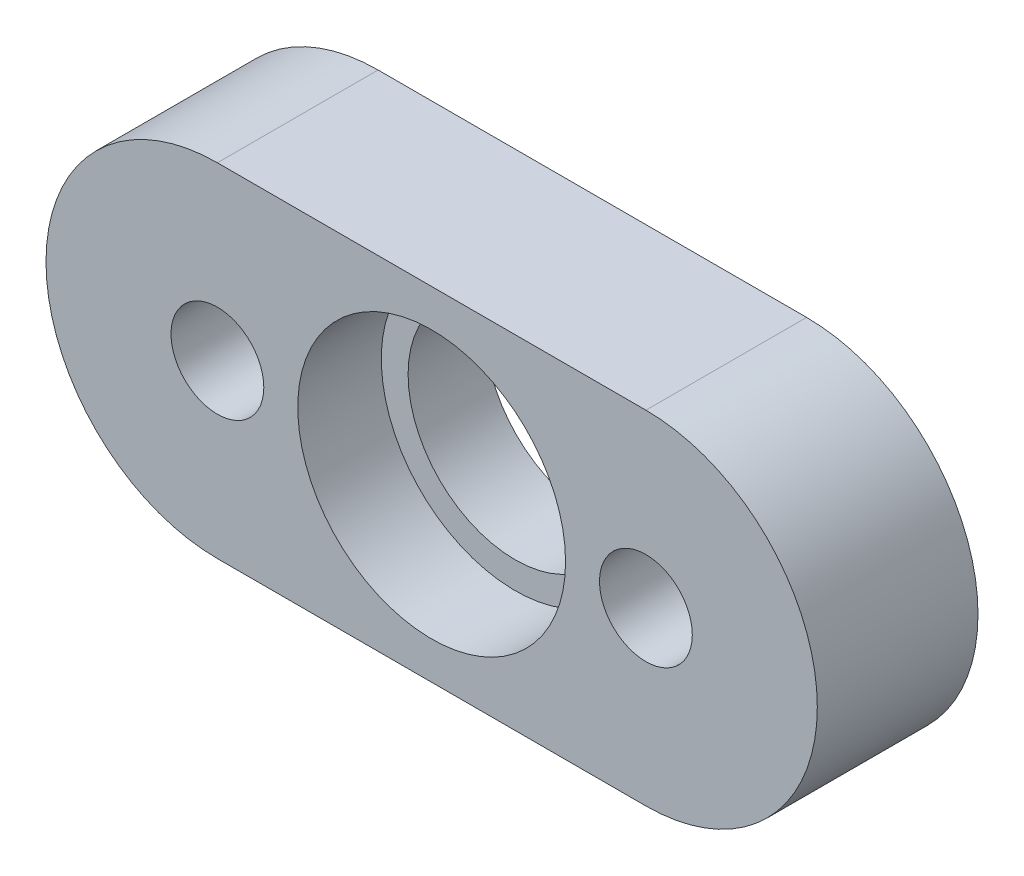
ISO-10303-21;
HEADER;
FILE_DESCRIPTION(('STEP AP214'),'2;1');
FILE_NAME('part.step','',(''),(''),'','','');
FILE_SCHEMA(('AUTOMOTIVE_DESIGN { 1 0 10303 214 1 1 1 1 }'));
ENDSEC;
DATA;
#1=APPLICATION_CONTEXT('core data for automotive mechanical design processes');
#2=APPLICATION_PROTOCOL_DEFINITION('international standard','automotive_design',2000,#1);
#3=PRODUCT_CONTEXT('',#1,'mechanical');
#4=PRODUCT('Part','Part','',(#3));
#5=PRODUCT_RELATED_PRODUCT_CATEGORY('part','',(#4));
#6=PRODUCT_DEFINITION_FORMATION('','',#4);
#7=PRODUCT_DEFINITION_CONTEXT('part definition',#1,'design');
#8=PRODUCT_DEFINITION('design','',#6,#7);
#9=PRODUCT_DEFINITION_SHAPE('','',#8);
#10=(LENGTH_UNIT() NAMED_UNIT(*) SI_UNIT(.MILLI.,.METRE.));
#11=(NAMED_UNIT(*) PLANE_ANGLE_UNIT() SI_UNIT($,.RADIAN.));
#12=(NAMED_UNIT(*) SI_UNIT($,.STERADIAN.) SOLID_ANGLE_UNIT());
#13=UNCERTAINTY_MEASURE_WITH_UNIT(LENGTH_MEASURE(1.E-05),#10,'distance_accuracy_value','');
#14=(GEOMETRIC_REPRESENTATION_CONTEXT(3) GLOBAL_UNCERTAINTY_ASSIGNED_CONTEXT((#13)) GLOBAL_UNIT_ASSIGNED_CONTEXT((#10,
#11,#12)) REPRESENTATION_CONTEXT('',''));
#15=CARTESIAN_POINT('',(0.,0.,0.));
#16=DIRECTION('',(0.,0.,1.));
#17=DIRECTION('',(1.,0.,0.));
#18=AXIS2_PLACEMENT_3D('',#15,#16,#17);
#19=CARTESIAN_POINT('',(-12.7,0.,9.525));
#20=DIRECTION('',(0.,0.,-1.));
#21=DIRECTION('',(-1.,0.,0.));
#22=AXIS2_PLACEMENT_3D('',#19,#20,#21);
#23=CYLINDRICAL_SURFACE('',#22,10.16);
#24=CARTESIAN_POINT('',(-12.7,0.,0.));
#25=DIRECTION('',(0.,0.,1.));
#26=DIRECTION('',(1.,0.,0.));
#27=AXIS2_PLACEMENT_3D('',#24,#25,#26);
#28=CIRCLE('',#27,10.16);
#29=CARTESIAN_POINT('',(-12.7,10.16,0.));
#30=VERTEX_POINT('',#29);
#31=CARTESIAN_POINT('',(-12.7,-10.16,0.));
#32=VERTEX_POINT('',#31);
#33=EDGE_CURVE('E98',#30,#32,#28,.T.);
#34=ORIENTED_EDGE('',*,*,#33,.T.);
#35=DIRECTION('',(0.,0.,-1.));
#36=VECTOR('',#35,1.);
#37=CARTESIAN_POINT('',(-12.7,-10.16,9.525));
#38=LINE('',#37,#36);
#39=CARTESIAN_POINT('',(-12.7,-10.16,9.525));
#40=VERTEX_POINT('',#39);
#41=EDGE_CURVE('E11',#40,#32,#38,.T.);
#42=ORIENTED_EDGE('',*,*,#41,.F.);
#43=CARTESIAN_POINT('',(-12.7,0.,9.525));
#44=DIRECTION('',(0.,0.,1.));
#45=DIRECTION('',(1.,0.,0.));
#46=AXIS2_PLACEMENT_3D('',#43,#44,#45);
#47=CIRCLE('',#46,10.16);
#48=CARTESIAN_POINT('',(-12.7,10.16,9.525));
#49=VERTEX_POINT('',#48);
#50=EDGE_CURVE('E85',#49,#40,#47,.T.);
#51=ORIENTED_EDGE('',*,*,#50,.F.);
#52=DIRECTION('',(0.,0.,-1.));
#53=VECTOR('',#52,1.);
#54=CARTESIAN_POINT('',(-12.7,10.16,9.525));
#55=LINE('',#54,#53);
#56=EDGE_CURVE('E94',#49,#30,#55,.T.);
#57=ORIENTED_EDGE('',*,*,#56,.T.);
#58=EDGE_LOOP('',(#34,#42,#51,#57));
#59=FACE_BOUND('',#58,.T.);
#60=ADVANCED_FACE('F33',(#59),#23,.T.);
#61=CARTESIAN_POINT('',(-12.7,-10.16,9.525));
#62=DIRECTION('',(0.,1.,0.));
#63=DIRECTION('',(-1.,0.,0.));
#64=AXIS2_PLACEMENT_3D('',#61,#62,#63);
#65=PLANE('',#64);
#66=DIRECTION('',(1.,0.,0.));
#67=VECTOR('',#66,1.);
#68=CARTESIAN_POINT('',(-12.7,-10.16,0.));
#69=LINE('',#68,#67);
#70=CARTESIAN_POINT('',(12.7,-10.16,0.));
#71=VERTEX_POINT('',#70);
#72=EDGE_CURVE('E89',#32,#71,#69,.T.);
#73=ORIENTED_EDGE('',*,*,#72,.T.);
#74=DIRECTION('',(0.,0.,-1.));
#75=VECTOR('',#74,1.);
#76=CARTESIAN_POINT('',(12.7,-10.16,9.525));
#77=LINE('',#76,#75);
#78=CARTESIAN_POINT('',(12.7,-10.16,9.525));
#79=VERTEX_POINT('',#78);
#80=EDGE_CURVE('E42',#79,#71,#77,.T.);
#81=ORIENTED_EDGE('',*,*,#80,.F.);
#82=DIRECTION('',(1.,0.,0.));
#83=VECTOR('',#82,1.);
#84=CARTESIAN_POINT('',(-12.7,-10.16,9.525));
#85=LINE('',#84,#83);
#86=EDGE_CURVE('E80',#40,#79,#85,.T.);
#87=ORIENTED_EDGE('',*,*,#86,.F.);
#88=ORIENTED_EDGE('',*,*,#41,.T.);
#89=EDGE_LOOP('',(#73,#81,#87,#88));
#90=FACE_BOUND('',#89,.T.);
#91=ADVANCED_FACE('F88',(#90),#65,.F.);
#92=CARTESIAN_POINT('',(12.7,0.,9.525));
#93=DIRECTION('',(0.,0.,-1.));
#94=DIRECTION('',(-1.,0.,0.));
#95=AXIS2_PLACEMENT_3D('',#92,#93,#94);
#96=CYLINDRICAL_SURFACE('',#95,10.16);
#97=CARTESIAN_POINT('',(12.7,0.,0.));
#98=DIRECTION('',(0.,0.,1.));
#99=DIRECTION('',(1.,0.,0.));
#100=AXIS2_PLACEMENT_3D('',#97,#98,#99);
#101=CIRCLE('',#100,10.16);
#102=CARTESIAN_POINT('',(12.7,10.16,0.));
#103=VERTEX_POINT('',#102);
#104=EDGE_CURVE('E67',#71,#103,#101,.T.);
#105=ORIENTED_EDGE('',*,*,#104,.T.);
#106=DIRECTION('',(0.,0.,-1.));
#107=VECTOR('',#106,1.);
#108=CARTESIAN_POINT('',(12.7,10.16,9.525));
#109=LINE('',#108,#107);
#110=CARTESIAN_POINT('',(12.7,10.16,9.525));
#111=VERTEX_POINT('',#110);
#112=EDGE_CURVE('E90',#111,#103,#109,.T.);
#113=ORIENTED_EDGE('',*,*,#112,.F.);
#114=CARTESIAN_POINT('',(12.7,0.,9.525));
#115=DIRECTION('',(0.,0.,1.));
#116=DIRECTION('',(1.,0.,0.));
#117=AXIS2_PLACEMENT_3D('',#114,#115,#116);
#118=CIRCLE('',#117,10.16);
#119=EDGE_CURVE('E83',#79,#111,#118,.T.);
#120=ORIENTED_EDGE('',*,*,#119,.F.);
#121=ORIENTED_EDGE('',*,*,#80,.T.);
#122=EDGE_LOOP('',(#105,#113,#120,#121));
#123=FACE_BOUND('',#122,.T.);
#124=ADVANCED_FACE('F92',(#123),#96,.T.);
#125=CARTESIAN_POINT('',(-12.7,10.16,9.525));
#126=DIRECTION('',(0.,-1.,0.));
#127=DIRECTION('',(1.,0.,0.));
#128=AXIS2_PLACEMENT_3D('',#125,#126,#127);
#129=PLANE('',#128);
#130=DIRECTION('',(-1.,0.,0.));
#131=VECTOR('',#130,1.);
#132=CARTESIAN_POINT('',(-12.7,10.16,0.));
#133=LINE('',#132,#131);
#134=EDGE_CURVE('E73',#103,#30,#133,.T.);
#135=ORIENTED_EDGE('',*,*,#134,.T.);
#136=ORIENTED_EDGE('',*,*,#56,.F.);
#137=DIRECTION('',(-1.,0.,0.));
#138=VECTOR('',#137,1.);
#139=CARTESIAN_POINT('',(-12.7,10.16,9.525));
#140=LINE('',#139,#138);
#141=EDGE_CURVE('E50',#111,#49,#140,.T.);
#142=ORIENTED_EDGE('',*,*,#141,.F.);
#143=ORIENTED_EDGE('',*,*,#112,.T.);
#144=EDGE_LOOP('',(#135,#136,#142,#143));
#145=FACE_BOUND('',#144,.T.);
#146=ADVANCED_FACE('F106',(#145),#129,.F.);
#147=CARTESIAN_POINT('',(-12.7,0.,9.525));
#148=DIRECTION('',(0.,0.,1.));
#149=DIRECTION('',(1.,0.,0.));
#150=AXIS2_PLACEMENT_3D('',#147,#148,#149);
#151=PLANE('',#150);
#152=CARTESIAN_POINT('',(12.7,0.,9.525));
#153=DIRECTION('',(0.,0.,1.));
#154=DIRECTION('',(-1.,0.,0.));
#155=AXIS2_PLACEMENT_3D('',#152,#153,#154);
#156=CIRCLE('',#155,2.75);
#157=CARTESIAN_POINT('',(15.45,0.,9.525));
#158=VERTEX_POINT('',#157);
#159=EDGE_CURVE('E121',#158,#158,#156,.T.);
#160=ORIENTED_EDGE('',*,*,#159,.F.);
#161=EDGE_LOOP('',(#160));
#162=FACE_BOUND('',#161,.T.);
#163=CARTESIAN_POINT('',(-12.7,0.,9.525));
#164=DIRECTION('',(0.,0.,1.));
#165=DIRECTION('',(1.,0.,0.));
#166=AXIS2_PLACEMENT_3D('',#163,#164,#165);
#167=CIRCLE('',#166,2.75);
#168=CARTESIAN_POINT('',(-9.95,0.,9.525));
#169=VERTEX_POINT('',#168);
#170=EDGE_CURVE('E127',#169,#169,#167,.T.);
#171=ORIENTED_EDGE('',*,*,#170,.F.);
#172=EDGE_LOOP('',(#171));
#173=FACE_BOUND('',#172,.T.);
#174=CARTESIAN_POINT('',(0.,0.,9.525));
#175=DIRECTION('',(0.,0.,1.));
#176=DIRECTION('',(1.,0.,0.));
#177=AXIS2_PLACEMENT_3D('',#174,#175,#176);
#178=CIRCLE('',#177,7.9375);
#179=CARTESIAN_POINT('',(7.9375,0.,9.525));
#180=VERTEX_POINT('',#179);
#181=EDGE_CURVE('E112',#180,#180,#178,.T.);
#182=ORIENTED_EDGE('',*,*,#181,.F.);
#183=EDGE_LOOP('',(#182));
#184=FACE_BOUND('',#183,.T.);
#185=ORIENTED_EDGE('',*,*,#50,.T.);
#186=ORIENTED_EDGE('',*,*,#86,.T.);
#187=ORIENTED_EDGE('',*,*,#119,.T.);
#188=ORIENTED_EDGE('',*,*,#141,.T.);
#189=EDGE_LOOP('',(#185,#186,#187,#188));
#190=FACE_BOUND('',#189,.T.);
#191=ADVANCED_FACE('F81',(#162,#173,#184,#190),#151,.T.);
#192=CARTESIAN_POINT('',(-12.7,0.,0.));
#193=DIRECTION('',(0.,0.,1.));
#194=DIRECTION('',(1.,0.,0.));
#195=AXIS2_PLACEMENT_3D('',#192,#193,#194);
#196=PLANE('',#195);
#197=CARTESIAN_POINT('',(12.7,0.,0.));
#198=DIRECTION('',(0.,0.,1.));
#199=DIRECTION('',(-1.,0.,0.));
#200=AXIS2_PLACEMENT_3D('',#197,#198,#199);
#201=CIRCLE('',#200,2.75);
#202=CARTESIAN_POINT('',(15.45,0.,0.));
#203=VERTEX_POINT('',#202);
#204=EDGE_CURVE('E124',#203,#203,#201,.T.);
#205=ORIENTED_EDGE('',*,*,#204,.T.);
#206=EDGE_LOOP('',(#205));
#207=FACE_BOUND('',#206,.T.);
#208=CARTESIAN_POINT('',(-12.7,0.,0.));
#209=DIRECTION('',(0.,0.,1.));
#210=DIRECTION('',(1.,0.,0.));
#211=AXIS2_PLACEMENT_3D('',#208,#209,#210);
#212=CIRCLE('',#211,2.75);
#213=CARTESIAN_POINT('',(-9.95,0.,0.));
#214=VERTEX_POINT('',#213);
#215=EDGE_CURVE('E120',#214,#214,#212,.T.);
#216=ORIENTED_EDGE('',*,*,#215,.T.);
#217=EDGE_LOOP('',(#216));
#218=FACE_BOUND('',#217,.T.);
#219=CARTESIAN_POINT('',(0.,0.,0.));
#220=DIRECTION('',(0.,0.,1.));
#221=DIRECTION('',(1.,0.,0.));
#222=AXIS2_PLACEMENT_3D('',#219,#220,#221);
#223=CIRCLE('',#222,6.35);
#224=CARTESIAN_POINT('',(6.35,0.,0.));
#225=VERTEX_POINT('',#224);
#226=EDGE_CURVE('E117',#225,#225,#223,.T.);
#227=ORIENTED_EDGE('',*,*,#226,.T.);
#228=EDGE_LOOP('',(#227));
#229=FACE_BOUND('',#228,.T.);
#230=ORIENTED_EDGE('',*,*,#33,.F.);
#231=ORIENTED_EDGE('',*,*,#134,.F.);
#232=ORIENTED_EDGE('',*,*,#104,.F.);
#233=ORIENTED_EDGE('',*,*,#72,.F.);
#234=EDGE_LOOP('',(#230,#231,#232,#233));
#235=FACE_BOUND('',#234,.T.);
#236=ADVANCED_FACE('F109',(#207,#218,#229,#235),#196,.F.);
#237=CARTESIAN_POINT('',(0.,0.,4.572));
#238=DIRECTION('',(0.,0.,1.));
#239=DIRECTION('',(1.,0.,0.));
#240=AXIS2_PLACEMENT_3D('',#237,#238,#239);
#241=CYLINDRICAL_SURFACE('',#240,7.9375);
#242=CARTESIAN_POINT('',(0.,0.,4.572));
#243=DIRECTION('',(0.,0.,1.));
#244=DIRECTION('',(1.,0.,0.));
#245=AXIS2_PLACEMENT_3D('',#242,#243,#244);
#246=CIRCLE('',#245,7.9375);
#247=CARTESIAN_POINT('',(7.9375,0.,4.572));
#248=VERTEX_POINT('',#247);
#249=EDGE_CURVE('E101',#248,#248,#246,.T.);
#250=ORIENTED_EDGE('',*,*,#249,.F.);
#251=EDGE_LOOP('',(#250));
#252=FACE_BOUND('',#251,.T.);
#253=ORIENTED_EDGE('',*,*,#181,.T.);
#254=EDGE_LOOP('',(#253));
#255=FACE_BOUND('',#254,.T.);
#256=ADVANCED_FACE('F149',(#252,#255),#241,.F.);
#257=CARTESIAN_POINT('',(0.,0.,4.572));
#258=DIRECTION('',(0.,0.,1.));
#259=DIRECTION('',(1.,0.,0.));
#260=AXIS2_PLACEMENT_3D('',#257,#258,#259);
#261=PLANE('',#260);
#262=CARTESIAN_POINT('',(0.,0.,4.572));
#263=DIRECTION('',(0.,0.,1.));
#264=DIRECTION('',(1.,0.,0.));
#265=AXIS2_PLACEMENT_3D('',#262,#263,#264);
#266=CIRCLE('',#265,6.35);
#267=CARTESIAN_POINT('',(6.35,0.,4.572));
#268=VERTEX_POINT('',#267);
#269=EDGE_CURVE('E36',#268,#268,#266,.T.);
#270=ORIENTED_EDGE('',*,*,#269,.F.);
#271=EDGE_LOOP('',(#270));
#272=FACE_BOUND('',#271,.T.);
#273=ORIENTED_EDGE('',*,*,#249,.T.);
#274=EDGE_LOOP('',(#273));
#275=FACE_BOUND('',#274,.T.);
#276=ADVANCED_FACE('F151',(#272,#275),#261,.T.);
#277=CARTESIAN_POINT('',(0.,0.,0.));
#278=DIRECTION('',(0.,0.,1.));
#279=DIRECTION('',(1.,0.,0.));
#280=AXIS2_PLACEMENT_3D('',#277,#278,#279);
#281=CYLINDRICAL_SURFACE('',#280,6.35);
#282=CARTESIAN_POINT('',(6.35,0.,4.572));
#283=CARTESIAN_POINT('',(6.35,0.,4.524375));
#284=CARTESIAN_POINT('',(6.35,0.,4.47675));
#285=CARTESIAN_POINT('',(6.35,0.,4.3815));
#286=CARTESIAN_POINT('',(6.35,0.,4.333875));
#287=CARTESIAN_POINT('',(6.35,0.,4.238625));
#288=CARTESIAN_POINT('',(6.35,0.,4.191));
#289=CARTESIAN_POINT('',(6.35,0.,4.09575));
#290=CARTESIAN_POINT('',(6.35,0.,4.048125));
#291=CARTESIAN_POINT('',(6.35,0.,3.952875));
#292=CARTESIAN_POINT('',(6.35,0.,3.90525));
#293=CARTESIAN_POINT('',(6.35,0.,3.81));
#294=CARTESIAN_POINT('',(6.35,0.,3.762375));
#295=CARTESIAN_POINT('',(6.35,0.,3.667125));
#296=CARTESIAN_POINT('',(6.35,0.,3.6195));
#297=CARTESIAN_POINT('',(6.35,0.,3.52425));
#298=CARTESIAN_POINT('',(6.35,0.,3.476625));
#299=CARTESIAN_POINT('',(6.35,0.,3.381375));
#300=CARTESIAN_POINT('',(6.35,0.,3.33375));
#301=CARTESIAN_POINT('',(6.35,0.,3.2385));
#302=CARTESIAN_POINT('',(6.35,0.,3.190875));
#303=CARTESIAN_POINT('',(6.35,0.,3.095625));
#304=CARTESIAN_POINT('',(6.35,0.,3.048));
#305=CARTESIAN_POINT('',(6.35,0.,2.95275));
#306=CARTESIAN_POINT('',(6.35,0.,2.905125));
#307=CARTESIAN_POINT('',(6.35,0.,2.809875));
#308=CARTESIAN_POINT('',(6.35,0.,2.76225));
#309=CARTESIAN_POINT('',(6.35,0.,2.667));
#310=CARTESIAN_POINT('',(6.35,0.,2.619375));
#311=CARTESIAN_POINT('',(6.35,0.,2.524125));
#312=CARTESIAN_POINT('',(6.35,0.,2.4765));
#313=CARTESIAN_POINT('',(6.35,0.,2.38125));
#314=CARTESIAN_POINT('',(6.35,0.,2.333625));
#315=CARTESIAN_POINT('',(6.35,0.,2.238375));
#316=CARTESIAN_POINT('',(6.35,0.,2.19075));
#317=CARTESIAN_POINT('',(6.35,0.,2.0955));
#318=CARTESIAN_POINT('',(6.35,0.,2.047875));
#319=CARTESIAN_POINT('',(6.35,0.,1.952625));
#320=CARTESIAN_POINT('',(6.35,0.,1.905));
#321=CARTESIAN_POINT('',(6.35,0.,1.80975));
#322=CARTESIAN_POINT('',(6.35,0.,1.762125));
#323=CARTESIAN_POINT('',(6.35,0.,1.666875));
#324=CARTESIAN_POINT('',(6.35,0.,1.61925));
#325=CARTESIAN_POINT('',(6.35,0.,1.524));
#326=CARTESIAN_POINT('',(6.35,0.,1.476375));
#327=CARTESIAN_POINT('',(6.35,0.,1.381125));
#328=CARTESIAN_POINT('',(6.35,0.,1.3335));
#329=CARTESIAN_POINT('',(6.35,0.,1.23825));
#330=CARTESIAN_POINT('',(6.35,0.,1.190625));
#331=CARTESIAN_POINT('',(6.35,0.,1.095375));
#332=CARTESIAN_POINT('',(6.35,0.,1.04775));
#333=CARTESIAN_POINT('',(6.35,0.,0.9525));
#334=CARTESIAN_POINT('',(6.35,0.,0.904875));
#335=CARTESIAN_POINT('',(6.35,0.,0.809625));
#336=CARTESIAN_POINT('',(6.35,0.,0.762));
#337=CARTESIAN_POINT('',(6.35,0.,0.66675));
#338=CARTESIAN_POINT('',(6.35,0.,0.619125));
#339=CARTESIAN_POINT('',(6.35,0.,0.523875));
#340=CARTESIAN_POINT('',(6.35,0.,0.47625));
#341=CARTESIAN_POINT('',(6.35,0.,0.381));
#342=CARTESIAN_POINT('',(6.35,0.,0.333375));
#343=CARTESIAN_POINT('',(6.35,0.,0.238125));
#344=CARTESIAN_POINT('',(6.35,0.,0.1905));
#345=CARTESIAN_POINT('',(6.35,0.,0.0952499999999999));
#346=CARTESIAN_POINT('',(6.35,0.,0.047625));
#347=CARTESIAN_POINT('',(6.35,0.,0.));
#348=B_SPLINE_CURVE_WITH_KNOTS('',3,(#282,#283,#284,#285,#286,#287,#288,#289,#290,#291,#292,
#293,#294,#295,#296,#297,#298,#299,#300,#301,#302,#303,#304,#305,#306,#307,#308,#309,#310,#311,
#312,#313,#314,#315,#316,#317,#318,#319,#320,#321,#322,#323,#324,#325,#326,#327,#328,#329,#330,
#331,#332,#333,#334,#335,#336,#337,#338,#339,#340,#341,#342,#343,#344,#345,#346,#347),
.UNSPECIFIED.,.F.,.F.,(4,2,2,2,2,2,2,2,2,2,2,2,2,2,2,2,2,2,2,2,2,2,2,2,2,2,2,2,2,2,2,2,4),(0.,
0.142875,0.28575,0.428625,0.5715,0.714375,0.85725,1.000125,1.143,1.285875,1.42875,1.571625,
1.7145,1.857375,2.00025,2.143125,2.286,2.428875,2.57175,2.714625,2.8575,3.000375,3.14325,
3.286125,3.429,3.571875,3.71475,3.857625,4.0005,4.143375,4.28625,4.429125,4.572),.UNSPECIFIED.);
#349=EDGE_CURVE('BSEAM139',#268,#225,#348,.T.);
#350=ORIENTED_EDGE('',*,*,#269,.T.);
#351=ORIENTED_EDGE('',*,*,#226,.F.);
#352=ORIENTED_EDGE('',*,*,#349,.T.);
#353=ORIENTED_EDGE('',*,*,#349,.F.);
#354=EDGE_LOOP('',(#350,#352,#351,#353));
#355=FACE_BOUND('',#354,.T.);
#356=ADVANCED_FACE('F139',(#355),#281,.F.);
#357=CARTESIAN_POINT('',(-12.7,0.,0.));
#358=DIRECTION('',(0.,0.,1.));
#359=DIRECTION('',(1.,0.,0.));
#360=AXIS2_PLACEMENT_3D('',#357,#358,#359);
#361=CYLINDRICAL_SURFACE('',#360,2.75);
#362=CARTESIAN_POINT('',(-9.95,0.,0.));
#363=CARTESIAN_POINT('',(-9.95,0.,0.0992187499999999));
#364=CARTESIAN_POINT('',(-9.95,0.,0.1984375));
#365=CARTESIAN_POINT('',(-9.95,0.,0.396875));
#366=CARTESIAN_POINT('',(-9.95,0.,0.49609375));
#367=CARTESIAN_POINT('',(-9.95,0.,0.69453125));
#368=CARTESIAN_POINT('',(-9.95,0.,0.79375));
#369=CARTESIAN_POINT('',(-9.95,0.,0.9921875));
#370=CARTESIAN_POINT('',(-9.95,0.,1.09140625));
#371=CARTESIAN_POINT('',(-9.95,0.,1.28984375));
#372=CARTESIAN_POINT('',(-9.95,0.,1.3890625));
#373=CARTESIAN_POINT('',(-9.95,0.,1.5875));
#374=CARTESIAN_POINT('',(-9.95,0.,1.68671875));
#375=CARTESIAN_POINT('',(-9.95,0.,1.88515625));
#376=CARTESIAN_POINT('',(-9.95,0.,1.984375));
#377=CARTESIAN_POINT('',(-9.95,0.,2.1828125));
#378=CARTESIAN_POINT('',(-9.95,0.,2.28203125));
#379=CARTESIAN_POINT('',(-9.95,0.,2.48046875));
#380=CARTESIAN_POINT('',(-9.95,0.,2.5796875));
#381=CARTESIAN_POINT('',(-9.95,0.,2.778125));
#382=CARTESIAN_POINT('',(-9.95,0.,2.87734375));
#383=CARTESIAN_POINT('',(-9.95,0.,3.07578125));
#384=CARTESIAN_POINT('',(-9.95,0.,3.175));
#385=CARTESIAN_POINT('',(-9.95,0.,3.3734375));
#386=CARTESIAN_POINT('',(-9.95,0.,3.47265625));
#387=CARTESIAN_POINT('',(-9.95,0.,3.67109375));
#388=CARTESIAN_POINT('',(-9.95,0.,3.7703125));
#389=CARTESIAN_POINT('',(-9.95,0.,3.96875));
#390=CARTESIAN_POINT('',(-9.95,0.,4.06796875));
#391=CARTESIAN_POINT('',(-9.95,0.,4.26640625));
#392=CARTESIAN_POINT('',(-9.95,0.,4.365625));
#393=CARTESIAN_POINT('',(-9.95,0.,4.5640625));
#394=CARTESIAN_POINT('',(-9.95,0.,4.66328125));
#395=CARTESIAN_POINT('',(-9.95,0.,4.86171875));
#396=CARTESIAN_POINT('',(-9.95,0.,4.9609375));
#397=CARTESIAN_POINT('',(-9.95,0.,5.159375));
#398=CARTESIAN_POINT('',(-9.95,0.,5.25859375));
#399=CARTESIAN_POINT('',(-9.95,0.,5.45703125));
#400=CARTESIAN_POINT('',(-9.95,0.,5.55625));
#401=CARTESIAN_POINT('',(-9.95,0.,5.7546875));
#402=CARTESIAN_POINT('',(-9.95,0.,5.85390625));
#403=CARTESIAN_POINT('',(-9.95,0.,6.05234375));
#404=CARTESIAN_POINT('',(-9.95,0.,6.1515625));
#405=CARTESIAN_POINT('',(-9.95,0.,6.35));
#406=CARTESIAN_POINT('',(-9.95,0.,6.44921875));
#407=CARTESIAN_POINT('',(-9.95,0.,6.64765625));
#408=CARTESIAN_POINT('',(-9.95,0.,6.746875));
#409=CARTESIAN_POINT('',(-9.95,0.,6.9453125));
#410=CARTESIAN_POINT('',(-9.95,0.,7.04453125));
#411=CARTESIAN_POINT('',(-9.95,0.,7.24296875));
#412=CARTESIAN_POINT('',(-9.95,0.,7.3421875));
#413=CARTESIAN_POINT('',(-9.95,0.,7.540625));
#414=CARTESIAN_POINT('',(-9.95,0.,7.63984375));
#415=CARTESIAN_POINT('',(-9.95,0.,7.83828125));
#416=CARTESIAN_POINT('',(-9.95,0.,7.9375));
#417=CARTESIAN_POINT('',(-9.95,0.,8.1359375));
#418=CARTESIAN_POINT('',(-9.95,0.,8.23515625));
#419=CARTESIAN_POINT('',(-9.95,0.,8.43359375));
#420=CARTESIAN_POINT('',(-9.95,0.,8.5328125));
#421=CARTESIAN_POINT('',(-9.95,0.,8.73125));
#422=CARTESIAN_POINT('',(-9.95,0.,8.83046875));
#423=CARTESIAN_POINT('',(-9.95,0.,9.02890625));
#424=CARTESIAN_POINT('',(-9.95,0.,9.128125));
#425=CARTESIAN_POINT('',(-9.95,0.,9.3265625));
#426=CARTESIAN_POINT('',(-9.95,0.,9.42578125));
#427=CARTESIAN_POINT('',(-9.95,0.,9.525));
#428=B_SPLINE_CURVE_WITH_KNOTS('',3,(#362,#363,#364,#365,#366,#367,#368,#369,#370,#371,#372,
#373,#374,#375,#376,#377,#378,#379,#380,#381,#382,#383,#384,#385,#386,#387,#388,#389,#390,#391,
#392,#393,#394,#395,#396,#397,#398,#399,#400,#401,#402,#403,#404,#405,#406,#407,#408,#409,#410,
#411,#412,#413,#414,#415,#416,#417,#418,#419,#420,#421,#422,#423,#424,#425,#426,#427),
.UNSPECIFIED.,.F.,.F.,(4,2,2,2,2,2,2,2,2,2,2,2,2,2,2,2,2,2,2,2,2,2,2,2,2,2,2,2,2,2,2,2,4),(0.,
0.29765625,0.5953125,0.89296875,1.190625,1.48828125,1.7859375,2.08359375,2.38125,2.67890625,
2.9765625,3.27421875,3.571875,3.86953125,4.1671875,4.46484375,4.7625,5.06015625,5.3578125,
5.65546875,5.953125,6.25078125,6.5484375,6.84609375,7.14375,7.44140625,7.7390625,8.03671875,
8.334375,8.63203125,8.9296875,9.22734375,9.525),.UNSPECIFIED.);
#429=EDGE_CURVE('BSEAM135',#214,#169,#428,.T.);
#430=ORIENTED_EDGE('',*,*,#215,.F.);
#431=ORIENTED_EDGE('',*,*,#170,.T.);
#432=ORIENTED_EDGE('',*,*,#429,.T.);
#433=ORIENTED_EDGE('',*,*,#429,.F.);
#434=EDGE_LOOP('',(#430,#432,#431,#433));
#435=FACE_BOUND('',#434,.T.);
#436=ADVANCED_FACE('F135',(#435),#361,.F.);
#437=CARTESIAN_POINT('',(12.7,0.,0.));
#438=DIRECTION('',(0.,0.,1.));
#439=DIRECTION('',(1.,0.,0.));
#440=AXIS2_PLACEMENT_3D('',#437,#438,#439);
#441=CYLINDRICAL_SURFACE('',#440,2.75);
#442=CARTESIAN_POINT('',(15.45,0.,0.));
#443=CARTESIAN_POINT('',(15.45,0.,0.0992187499999999));
#444=CARTESIAN_POINT('',(15.45,0.,0.1984375));
#445=CARTESIAN_POINT('',(15.45,0.,0.396875));
#446=CARTESIAN_POINT('',(15.45,0.,0.49609375));
#447=CARTESIAN_POINT('',(15.45,0.,0.69453125));
#448=CARTESIAN_POINT('',(15.45,0.,0.79375));
#449=CARTESIAN_POINT('',(15.45,0.,0.9921875));
#450=CARTESIAN_POINT('',(15.45,0.,1.09140625));
#451=CARTESIAN_POINT('',(15.45,0.,1.28984375));
#452=CARTESIAN_POINT('',(15.45,0.,1.3890625));
#453=CARTESIAN_POINT('',(15.45,0.,1.5875));
#454=CARTESIAN_POINT('',(15.45,0.,1.68671875));
#455=CARTESIAN_POINT('',(15.45,0.,1.88515625));
#456=CARTESIAN_POINT('',(15.45,0.,1.984375));
#457=CARTESIAN_POINT('',(15.45,0.,2.1828125));
#458=CARTESIAN_POINT('',(15.45,0.,2.28203125));
#459=CARTESIAN_POINT('',(15.45,0.,2.48046875));
#460=CARTESIAN_POINT('',(15.45,0.,2.5796875));
#461=CARTESIAN_POINT('',(15.45,0.,2.778125));
#462=CARTESIAN_POINT('',(15.45,0.,2.87734375));
#463=CARTESIAN_POINT('',(15.45,0.,3.07578125));
#464=CARTESIAN_POINT('',(15.45,0.,3.175));
#465=CARTESIAN_POINT('',(15.45,0.,3.3734375));
#466=CARTESIAN_POINT('',(15.45,0.,3.47265625));
#467=CARTESIAN_POINT('',(15.45,0.,3.67109375));
#468=CARTESIAN_POINT('',(15.45,0.,3.7703125));
#469=CARTESIAN_POINT('',(15.45,0.,3.96875));
#470=CARTESIAN_POINT('',(15.45,0.,4.06796875));
#471=CARTESIAN_POINT('',(15.45,0.,4.26640625));
#472=CARTESIAN_POINT('',(15.45,0.,4.365625));
#473=CARTESIAN_POINT('',(15.45,0.,4.5640625));
#474=CARTESIAN_POINT('',(15.45,0.,4.66328125));
#475=CARTESIAN_POINT('',(15.45,0.,4.86171875));
#476=CARTESIAN_POINT('',(15.45,0.,4.9609375));
#477=CARTESIAN_POINT('',(15.45,0.,5.159375));
#478=CARTESIAN_POINT('',(15.45,0.,5.25859375));
#479=CARTESIAN_POINT('',(15.45,0.,5.45703125));
#480=CARTESIAN_POINT('',(15.45,0.,5.55625));
#481=CARTESIAN_POINT('',(15.45,0.,5.7546875));
#482=CARTESIAN_POINT('',(15.45,0.,5.85390625));
#483=CARTESIAN_POINT('',(15.45,0.,6.05234375));
#484=CARTESIAN_POINT('',(15.45,0.,6.1515625));
#485=CARTESIAN_POINT('',(15.45,0.,6.35));
#486=CARTESIAN_POINT('',(15.45,0.,6.44921875));
#487=CARTESIAN_POINT('',(15.45,0.,6.64765625));
#488=CARTESIAN_POINT('',(15.45,0.,6.746875));
#489=CARTESIAN_POINT('',(15.45,0.,6.9453125));
#490=CARTESIAN_POINT('',(15.45,0.,7.04453125));
#491=CARTESIAN_POINT('',(15.45,0.,7.24296875));
#492=CARTESIAN_POINT('',(15.45,0.,7.3421875));
#493=CARTESIAN_POINT('',(15.45,0.,7.540625));
#494=CARTESIAN_POINT('',(15.45,0.,7.63984375));
#495=CARTESIAN_POINT('',(15.45,0.,7.83828125));
#496=CARTESIAN_POINT('',(15.45,0.,7.9375));
#497=CARTESIAN_POINT('',(15.45,0.,8.1359375));
#498=CARTESIAN_POINT('',(15.45,0.,8.23515625));
#499=CARTESIAN_POINT('',(15.45,0.,8.43359375));
#500=CARTESIAN_POINT('',(15.45,0.,8.5328125));
#501=CARTESIAN_POINT('',(15.45,0.,8.73125));
#502=CARTESIAN_POINT('',(15.45,0.,8.83046875));
#503=CARTESIAN_POINT('',(15.45,0.,9.02890625));
#504=CARTESIAN_POINT('',(15.45,0.,9.128125));
#505=CARTESIAN_POINT('',(15.45,0.,9.3265625));
#506=CARTESIAN_POINT('',(15.45,0.,9.42578125));
#507=CARTESIAN_POINT('',(15.45,0.,9.525));
#508=B_SPLINE_CURVE_WITH_KNOTS('',3,(#442,#443,#444,#445,#446,#447,#448,#449,#450,#451,#452,
#453,#454,#455,#456,#457,#458,#459,#460,#461,#462,#463,#464,#465,#466,#467,#468,#469,#470,#471,
#472,#473,#474,#475,#476,#477,#478,#479,#480,#481,#482,#483,#484,#485,#486,#487,#488,#489,#490,
#491,#492,#493,#494,#495,#496,#497,#498,#499,#500,#501,#502,#503,#504,#505,#506,#507),
.UNSPECIFIED.,.F.,.F.,(4,2,2,2,2,2,2,2,2,2,2,2,2,2,2,2,2,2,2,2,2,2,2,2,2,2,2,2,2,2,2,2,4),(0.,
0.29765625,0.5953125,0.89296875,1.190625,1.48828125,1.7859375,2.08359375,2.38125,2.67890625,
2.9765625,3.27421875,3.571875,3.86953125,4.1671875,4.46484375,4.7625,5.06015625,5.3578125,
5.65546875,5.953125,6.25078125,6.5484375,6.84609375,7.14375,7.44140625,7.7390625,8.03671875,
8.334375,8.63203125,8.9296875,9.22734375,9.525),.UNSPECIFIED.);
#509=EDGE_CURVE('BSEAM138',#203,#158,#508,.T.);
#510=ORIENTED_EDGE('',*,*,#204,.F.);
#511=ORIENTED_EDGE('',*,*,#159,.T.);
#512=ORIENTED_EDGE('',*,*,#509,.T.);
#513=ORIENTED_EDGE('',*,*,#509,.F.);
#514=EDGE_LOOP('',(#510,#512,#511,#513));
#515=FACE_BOUND('',#514,.T.);
#516=ADVANCED_FACE('F138',(#515),#441,.F.);
#517=CLOSED_SHELL('',(#60,#91,#124,#146,#191,#236,#256,#276,#356,#436,#516));
#518=MANIFOLD_SOLID_BREP('B2',#517);
#519=ADVANCED_BREP_SHAPE_REPRESENTATION('',(#18,#518),#14);
#520=SHAPE_DEFINITION_REPRESENTATION(#9,#519);
ENDSEC;
END-ISO-10303-21;
